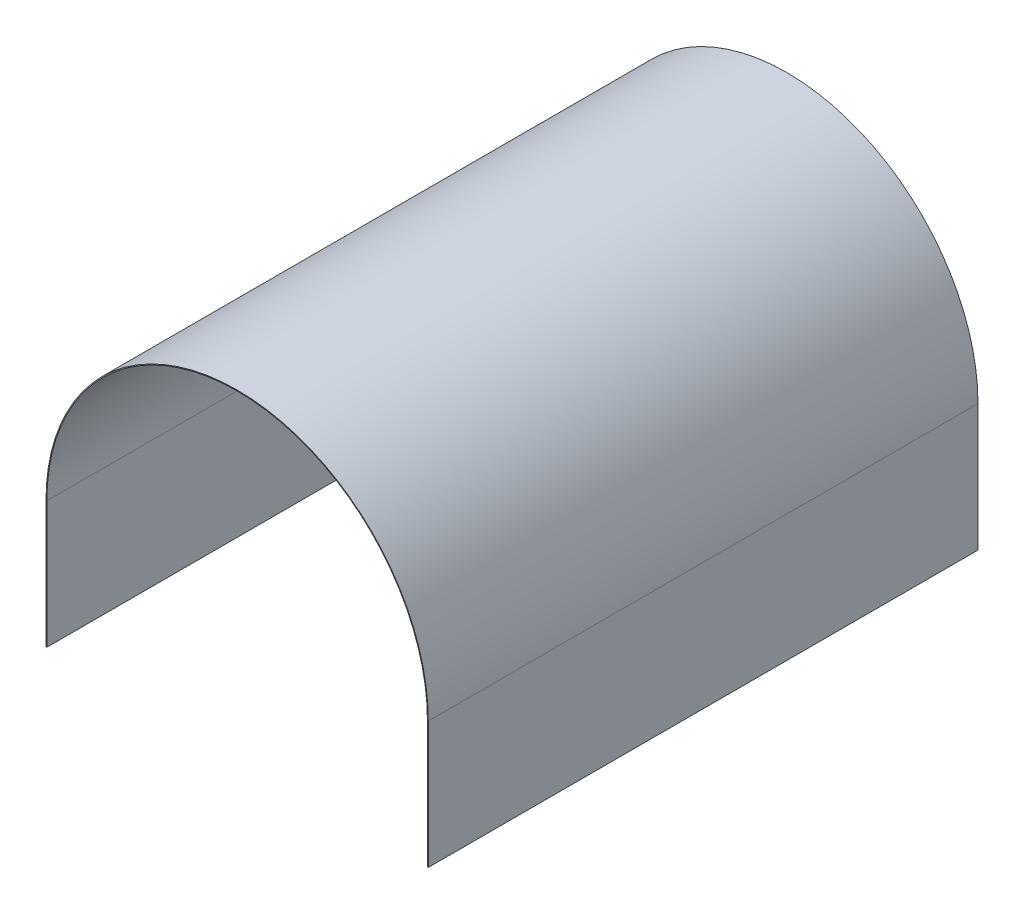
ISO-10303-21;
HEADER;
FILE_DESCRIPTION(('STEP AP214'),'2;1');
FILE_NAME('part.step','',(''),(''),'','','');
FILE_SCHEMA(('AUTOMOTIVE_DESIGN { 1 0 10303 214 1 1 1 1 }'));
ENDSEC;
DATA;
#1=APPLICATION_CONTEXT('core data for automotive mechanical design processes');
#2=APPLICATION_PROTOCOL_DEFINITION('international standard','automotive_design',2000,#1);
#3=PRODUCT_CONTEXT('',#1,'mechanical');
#4=PRODUCT('Part','Part','',(#3));
#5=PRODUCT_RELATED_PRODUCT_CATEGORY('part','',(#4));
#6=PRODUCT_DEFINITION_FORMATION('','',#4);
#7=PRODUCT_DEFINITION_CONTEXT('part definition',#1,'design');
#8=PRODUCT_DEFINITION('design','',#6,#7);
#9=PRODUCT_DEFINITION_SHAPE('','',#8);
#10=(LENGTH_UNIT() NAMED_UNIT(*) SI_UNIT(.MILLI.,.METRE.));
#11=(NAMED_UNIT(*) PLANE_ANGLE_UNIT() SI_UNIT($,.RADIAN.));
#12=(NAMED_UNIT(*) SI_UNIT($,.STERADIAN.) SOLID_ANGLE_UNIT());
#13=UNCERTAINTY_MEASURE_WITH_UNIT(LENGTH_MEASURE(1.E-05),#10,'distance_accuracy_value','');
#14=(GEOMETRIC_REPRESENTATION_CONTEXT(3) GLOBAL_UNCERTAINTY_ASSIGNED_CONTEXT((#13)) GLOBAL_UNIT_ASSIGNED_CONTEXT((#10,
#11,#12)) REPRESENTATION_CONTEXT('',''));
#15=CARTESIAN_POINT('',(0.,0.,0.));
#16=DIRECTION('',(0.,0.,1.));
#17=DIRECTION('',(1.,0.,0.));
#18=AXIS2_PLACEMENT_3D('',#15,#16,#17);
#19=CARTESIAN_POINT('',(-228.6,-189.23,660.4));
#20=DIRECTION('',(0.,1.,0.));
#21=DIRECTION('',(0.,0.,1.));
#22=AXIS2_PLACEMENT_3D('',#19,#20,#21);
#23=PLANE('',#22);
#24=DIRECTION('',(1.,0.,0.));
#25=VECTOR('',#24,1.);
#26=CARTESIAN_POINT('',(-228.6,-189.23,660.4));
#27=LINE('',#26,#25);
#28=CARTESIAN_POINT('',(229.616,-189.23,660.4));
#29=VERTEX_POINT('',#28);
#30=CARTESIAN_POINT('',(230.632,-189.23,660.4));
#31=VERTEX_POINT('',#30);
#32=EDGE_CURVE('E87',#29,#31,#27,.T.);
#33=ORIENTED_EDGE('',*,*,#32,.F.);
#34=DIRECTION('',(0.,0.,1.));
#35=VECTOR('',#34,1.);
#36=CARTESIAN_POINT('',(229.616,-189.23,0.));
#37=LINE('',#36,#35);
#38=CARTESIAN_POINT('',(229.616,-189.23,0.));
#39=VERTEX_POINT('',#38);
#40=EDGE_CURVE('E138',#39,#29,#37,.T.);
#41=ORIENTED_EDGE('',*,*,#40,.F.);
#42=DIRECTION('',(1.,0.,0.));
#43=VECTOR('',#42,1.);
#44=CARTESIAN_POINT('',(-228.6,-189.23,0.));
#45=LINE('',#44,#43);
#46=CARTESIAN_POINT('',(230.632,-189.23,0.));
#47=VERTEX_POINT('',#46);
#48=EDGE_CURVE('E129',#39,#47,#45,.T.);
#49=ORIENTED_EDGE('',*,*,#48,.T.);
#50=DIRECTION('',(0.,0.,-1.));
#51=VECTOR('',#50,1.);
#52=CARTESIAN_POINT('',(230.632,-189.23,660.4));
#53=LINE('',#52,#51);
#54=EDGE_CURVE('E11',#31,#47,#53,.T.);
#55=ORIENTED_EDGE('',*,*,#54,.F.);
#56=EDGE_LOOP('',(#33,#41,#49,#55));
#57=FACE_BOUND('',#56,.T.);
#58=ADVANCED_FACE('F35',(#57),#23,.F.);
#59=CARTESIAN_POINT('',(-228.6,-189.23,0.));
#60=VERTEX_POINT('',#59);
#61=CARTESIAN_POINT('',(-227.584,-189.23,0.));
#62=VERTEX_POINT('',#61);
#63=EDGE_CURVE('E152',#60,#62,#45,.T.);
#64=ORIENTED_EDGE('',*,*,#63,.T.);
#65=DIRECTION('',(0.,0.,1.));
#66=VECTOR('',#65,1.);
#67=CARTESIAN_POINT('',(-227.584,-189.23,0.));
#68=LINE('',#67,#66);
#69=CARTESIAN_POINT('',(-227.584,-189.23,660.4));
#70=VERTEX_POINT('',#69);
#71=EDGE_CURVE('E140',#62,#70,#68,.T.);
#72=ORIENTED_EDGE('',*,*,#71,.T.);
#73=CARTESIAN_POINT('',(-228.6,-189.23,660.4));
#74=VERTEX_POINT('',#73);
#75=EDGE_CURVE('E144',#74,#70,#27,.T.);
#76=ORIENTED_EDGE('',*,*,#75,.F.);
#77=DIRECTION('',(0.,0.,-1.));
#78=VECTOR('',#77,1.);
#79=CARTESIAN_POINT('',(-228.6,-189.23,660.4));
#80=LINE('',#79,#78);
#81=EDGE_CURVE('E151',#74,#60,#80,.T.);
#82=ORIENTED_EDGE('',*,*,#81,.T.);
#83=EDGE_LOOP('',(#64,#72,#76,#82));
#84=FACE_BOUND('',#83,.T.);
#85=ADVANCED_FACE('F37',(#84),#23,.F.);
#86=CARTESIAN_POINT('',(230.632,-36.83,660.4));
#87=DIRECTION('',(-1.,0.,0.));
#88=DIRECTION('',(0.,0.,1.));
#89=AXIS2_PLACEMENT_3D('',#86,#87,#88);
#90=PLANE('',#89);
#91=DIRECTION('',(0.,1.,0.));
#92=VECTOR('',#91,1.);
#93=CARTESIAN_POINT('',(230.632,-36.83,0.));
#94=LINE('',#93,#92);
#95=CARTESIAN_POINT('',(230.632,-36.83,0.));
#96=VERTEX_POINT('',#95);
#97=EDGE_CURVE('E155',#47,#96,#94,.T.);
#98=ORIENTED_EDGE('',*,*,#97,.T.);
#99=DIRECTION('',(0.,0.,-1.));
#100=VECTOR('',#99,1.);
#101=CARTESIAN_POINT('',(230.632,-36.83,660.4));
#102=LINE('',#101,#100);
#103=CARTESIAN_POINT('',(230.632,-36.83,660.4));
#104=VERTEX_POINT('',#103);
#105=EDGE_CURVE('E43',#104,#96,#102,.T.);
#106=ORIENTED_EDGE('',*,*,#105,.F.);
#107=DIRECTION('',(0.,1.,0.));
#108=VECTOR('',#107,1.);
#109=CARTESIAN_POINT('',(230.632,-36.83,660.4));
#110=LINE('',#109,#108);
#111=EDGE_CURVE('E146',#31,#104,#110,.T.);
#112=ORIENTED_EDGE('',*,*,#111,.F.);
#113=ORIENTED_EDGE('',*,*,#54,.T.);
#114=EDGE_LOOP('',(#98,#106,#112,#113));
#115=FACE_BOUND('',#114,.T.);
#116=ADVANCED_FACE('F182',(#115),#90,.F.);
#117=CARTESIAN_POINT('',(1.01599999999996,-36.83,660.4));
#118=DIRECTION('',(0.,0.,-1.));
#119=DIRECTION('',(-1.,0.,0.));
#120=AXIS2_PLACEMENT_3D('',#117,#118,#119);
#121=CYLINDRICAL_SURFACE('',#120,229.616);
#122=CARTESIAN_POINT('',(1.01599999999996,-36.83,0.));
#123=DIRECTION('',(0.,0.,1.));
#124=DIRECTION('',(1.,0.,0.));
#125=AXIS2_PLACEMENT_3D('',#122,#123,#124);
#126=CIRCLE('',#125,229.616);
#127=CARTESIAN_POINT('',(-228.6,-36.83,0.));
#128=VERTEX_POINT('',#127);
#129=EDGE_CURVE('E157',#96,#128,#126,.T.);
#130=ORIENTED_EDGE('',*,*,#129,.T.);
#131=DIRECTION('',(0.,0.,-1.));
#132=VECTOR('',#131,1.);
#133=CARTESIAN_POINT('',(-228.6,-36.83,660.4));
#134=LINE('',#133,#132);
#135=CARTESIAN_POINT('',(-228.6,-36.83,660.4));
#136=VERTEX_POINT('',#135);
#137=EDGE_CURVE('E161',#136,#128,#134,.T.);
#138=ORIENTED_EDGE('',*,*,#137,.F.);
#139=CARTESIAN_POINT('',(1.01599999999996,-36.83,660.4));
#140=DIRECTION('',(0.,0.,1.));
#141=DIRECTION('',(1.,0.,0.));
#142=AXIS2_PLACEMENT_3D('',#139,#140,#141);
#143=CIRCLE('',#142,229.616);
#144=EDGE_CURVE('E148',#104,#136,#143,.T.);
#145=ORIENTED_EDGE('',*,*,#144,.F.);
#146=ORIENTED_EDGE('',*,*,#105,.T.);
#147=EDGE_LOOP('',(#130,#138,#145,#146));
#148=FACE_BOUND('',#147,.T.);
#149=ADVANCED_FACE('F167',(#148),#121,.T.);
#150=CARTESIAN_POINT('',(-228.6,-36.83,660.4));
#151=DIRECTION('',(1.,0.,0.));
#152=DIRECTION('',(0.,1.,0.));
#153=AXIS2_PLACEMENT_3D('',#150,#151,#152);
#154=PLANE('',#153);
#155=DIRECTION('',(0.,-1.,0.));
#156=VECTOR('',#155,1.);
#157=CARTESIAN_POINT('',(-228.6,-36.83,0.));
#158=LINE('',#157,#156);
#159=EDGE_CURVE('E80',#128,#60,#158,.T.);
#160=ORIENTED_EDGE('',*,*,#159,.T.);
#161=ORIENTED_EDGE('',*,*,#81,.F.);
#162=DIRECTION('',(0.,-1.,0.));
#163=VECTOR('',#162,1.);
#164=CARTESIAN_POINT('',(-228.6,-36.83,660.4));
#165=LINE('',#164,#163);
#166=EDGE_CURVE('E59',#136,#74,#165,.T.);
#167=ORIENTED_EDGE('',*,*,#166,.F.);
#168=ORIENTED_EDGE('',*,*,#137,.T.);
#169=EDGE_LOOP('',(#160,#161,#167,#168));
#170=FACE_BOUND('',#169,.T.);
#171=ADVANCED_FACE('F173',(#170),#154,.F.);
#172=CARTESIAN_POINT('',(1.01599999999996,-36.83,660.4));
#173=DIRECTION('',(0.,0.,1.));
#174=DIRECTION('',(1.,0.,0.));
#175=AXIS2_PLACEMENT_3D('',#172,#173,#174);
#176=PLANE('',#175);
#177=DIRECTION('',(0.,1.,0.));
#178=VECTOR('',#177,1.);
#179=CARTESIAN_POINT('',(229.616,-36.83,660.4));
#180=LINE('',#179,#178);
#181=CARTESIAN_POINT('',(229.616,-36.83,660.4));
#182=VERTEX_POINT('',#181);
#183=EDGE_CURVE('E115',#29,#182,#180,.T.);
#184=ORIENTED_EDGE('',*,*,#183,.F.);
#185=ORIENTED_EDGE('',*,*,#32,.T.);
#186=ORIENTED_EDGE('',*,*,#111,.T.);
#187=ORIENTED_EDGE('',*,*,#144,.T.);
#188=ORIENTED_EDGE('',*,*,#166,.T.);
#189=ORIENTED_EDGE('',*,*,#75,.T.);
#190=DIRECTION('',(0.,-1.,0.));
#191=VECTOR('',#190,1.);
#192=CARTESIAN_POINT('',(-227.584,-36.83,660.4));
#193=LINE('',#192,#191);
#194=CARTESIAN_POINT('',(-227.584,-36.83,660.4));
#195=VERTEX_POINT('',#194);
#196=EDGE_CURVE('E130',#195,#70,#193,.T.);
#197=ORIENTED_EDGE('',*,*,#196,.F.);
#198=CARTESIAN_POINT('',(1.01599999999996,-36.83,660.4));
#199=DIRECTION('',(0.,0.,1.));
#200=DIRECTION('',(1.,0.,0.));
#201=AXIS2_PLACEMENT_3D('',#198,#199,#200);
#202=CIRCLE('',#201,228.6);
#203=EDGE_CURVE('E132',#182,#195,#202,.T.);
#204=ORIENTED_EDGE('',*,*,#203,.F.);
#205=EDGE_LOOP('',(#184,#185,#186,#187,#188,#189,#197,#204));
#206=FACE_BOUND('',#205,.T.);
#207=ADVANCED_FACE('F175',(#206),#176,.T.);
#208=CARTESIAN_POINT('',(1.01599999999996,-36.83,0.));
#209=DIRECTION('',(0.,0.,1.));
#210=DIRECTION('',(1.,0.,0.));
#211=AXIS2_PLACEMENT_3D('',#208,#209,#210);
#212=PLANE('',#211);
#213=ORIENTED_EDGE('',*,*,#48,.F.);
#214=DIRECTION('',(0.,1.,0.));
#215=VECTOR('',#214,1.);
#216=CARTESIAN_POINT('',(229.616,-36.83,0.));
#217=LINE('',#216,#215);
#218=CARTESIAN_POINT('',(229.616,-36.83,0.));
#219=VERTEX_POINT('',#218);
#220=EDGE_CURVE('E113',#39,#219,#217,.T.);
#221=ORIENTED_EDGE('',*,*,#220,.T.);
#222=CARTESIAN_POINT('',(1.01599999999996,-36.83,0.));
#223=DIRECTION('',(0.,0.,1.));
#224=DIRECTION('',(1.,0.,0.));
#225=AXIS2_PLACEMENT_3D('',#222,#223,#224);
#226=CIRCLE('',#225,228.6);
#227=CARTESIAN_POINT('',(-227.584,-36.83,0.));
#228=VERTEX_POINT('',#227);
#229=EDGE_CURVE('E122',#219,#228,#226,.T.);
#230=ORIENTED_EDGE('',*,*,#229,.T.);
#231=DIRECTION('',(0.,-1.,0.));
#232=VECTOR('',#231,1.);
#233=CARTESIAN_POINT('',(-227.584,-36.83,0.));
#234=LINE('',#233,#232);
#235=EDGE_CURVE('E50',#228,#62,#234,.T.);
#236=ORIENTED_EDGE('',*,*,#235,.T.);
#237=ORIENTED_EDGE('',*,*,#63,.F.);
#238=ORIENTED_EDGE('',*,*,#159,.F.);
#239=ORIENTED_EDGE('',*,*,#129,.F.);
#240=ORIENTED_EDGE('',*,*,#97,.F.);
#241=EDGE_LOOP('',(#213,#221,#230,#236,#237,#238,#239,#240));
#242=FACE_BOUND('',#241,.T.);
#243=ADVANCED_FACE('F127',(#242),#212,.F.);
#244=CARTESIAN_POINT('',(229.616,-36.83,0.));
#245=DIRECTION('',(1.,0.,0.));
#246=DIRECTION('',(0.,1.,0.));
#247=AXIS2_PLACEMENT_3D('',#244,#245,#246);
#248=PLANE('',#247);
#249=ORIENTED_EDGE('',*,*,#183,.T.);
#250=DIRECTION('',(0.,0.,1.));
#251=VECTOR('',#250,1.);
#252=CARTESIAN_POINT('',(229.616,-36.83,0.));
#253=LINE('',#252,#251);
#254=EDGE_CURVE('E109',#219,#182,#253,.T.);
#255=ORIENTED_EDGE('',*,*,#254,.F.);
#256=ORIENTED_EDGE('',*,*,#220,.F.);
#257=ORIENTED_EDGE('',*,*,#40,.T.);
#258=EDGE_LOOP('',(#249,#255,#256,#257));
#259=FACE_BOUND('',#258,.T.);
#260=ADVANCED_FACE('F111',(#259),#248,.F.);
#261=CARTESIAN_POINT('',(-227.584,-36.83,0.));
#262=DIRECTION('',(-1.,0.,0.));
#263=DIRECTION('',(0.,-1.,0.));
#264=AXIS2_PLACEMENT_3D('',#261,#262,#263);
#265=PLANE('',#264);
#266=ORIENTED_EDGE('',*,*,#196,.T.);
#267=ORIENTED_EDGE('',*,*,#71,.F.);
#268=ORIENTED_EDGE('',*,*,#235,.F.);
#269=DIRECTION('',(0.,0.,1.));
#270=VECTOR('',#269,1.);
#271=CARTESIAN_POINT('',(-227.584,-36.83,0.));
#272=LINE('',#271,#270);
#273=EDGE_CURVE('E119',#228,#195,#272,.T.);
#274=ORIENTED_EDGE('',*,*,#273,.T.);
#275=EDGE_LOOP('',(#266,#267,#268,#274));
#276=FACE_BOUND('',#275,.T.);
#277=ADVANCED_FACE('F192',(#276),#265,.F.);
#278=CARTESIAN_POINT('',(1.01599999999996,-36.83,0.));
#279=DIRECTION('',(0.,0.,1.));
#280=DIRECTION('',(1.,0.,0.));
#281=AXIS2_PLACEMENT_3D('',#278,#279,#280);
#282=CYLINDRICAL_SURFACE('',#281,228.6);
#283=ORIENTED_EDGE('',*,*,#203,.T.);
#284=ORIENTED_EDGE('',*,*,#273,.F.);
#285=ORIENTED_EDGE('',*,*,#229,.F.);
#286=ORIENTED_EDGE('',*,*,#254,.T.);
#287=EDGE_LOOP('',(#283,#284,#285,#286));
#288=FACE_BOUND('',#287,.T.);
#289=ADVANCED_FACE('F123',(#288),#282,.F.);
#290=CLOSED_SHELL('',(#58,#85,#116,#149,#171,#207,#243,#260,#277,#289));
#291=MANIFOLD_SOLID_BREP('B2',#290);
#292=ADVANCED_BREP_SHAPE_REPRESENTATION('',(#18,#291),#14);
#293=SHAPE_DEFINITION_REPRESENTATION(#9,#292);
ENDSEC;
END-ISO-10303-21;
